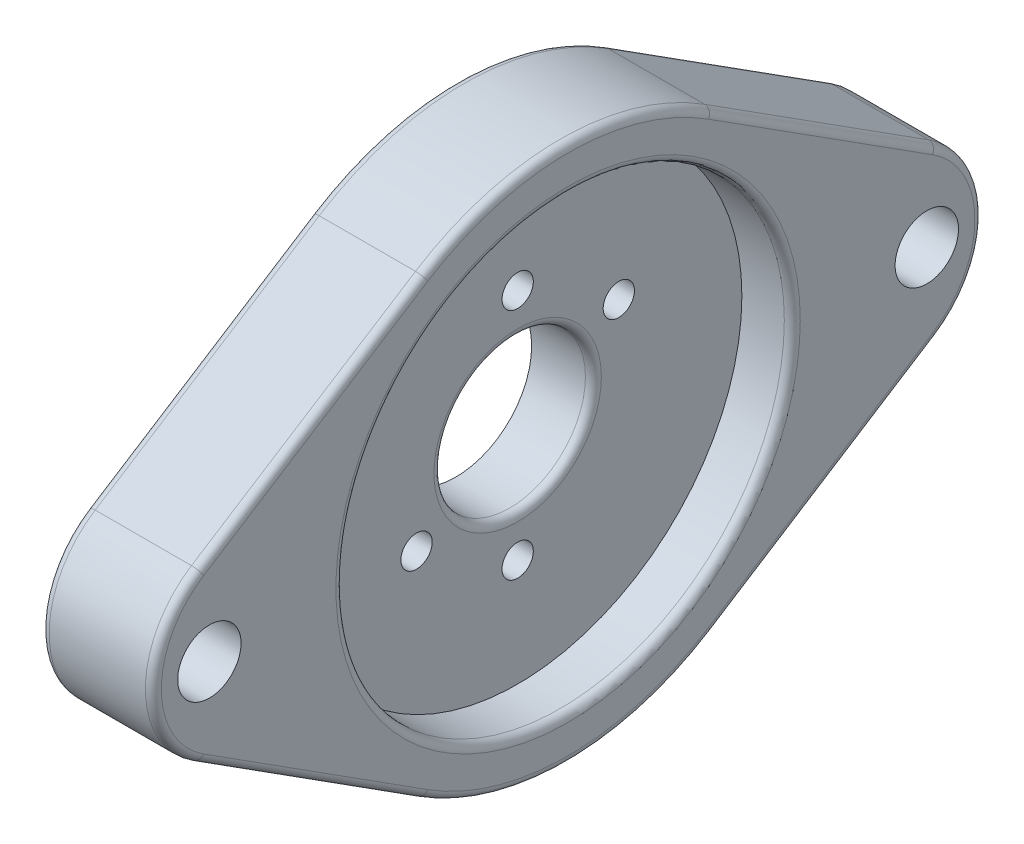
ISO-10303-21;
HEADER;
FILE_DESCRIPTION(('STEP AP214'),'2;1');
FILE_NAME('part.step','',(''),(''),'','','');
FILE_SCHEMA(('AUTOMOTIVE_DESIGN { 1 0 10303 214 1 1 1 1 }'));
ENDSEC;
DATA;
#1=APPLICATION_CONTEXT('core data for automotive mechanical design processes');
#2=APPLICATION_PROTOCOL_DEFINITION('international standard','automotive_design',2000,#1);
#3=PRODUCT_CONTEXT('',#1,'mechanical');
#4=PRODUCT('Part','Part','',(#3));
#5=PRODUCT_RELATED_PRODUCT_CATEGORY('part','',(#4));
#6=PRODUCT_DEFINITION_FORMATION('','',#4);
#7=PRODUCT_DEFINITION_CONTEXT('part definition',#1,'design');
#8=PRODUCT_DEFINITION('design','',#6,#7);
#9=PRODUCT_DEFINITION_SHAPE('','',#8);
#10=(LENGTH_UNIT() NAMED_UNIT(*) SI_UNIT(.MILLI.,.METRE.));
#11=(NAMED_UNIT(*) PLANE_ANGLE_UNIT() SI_UNIT($,.RADIAN.));
#12=(NAMED_UNIT(*) SI_UNIT($,.STERADIAN.) SOLID_ANGLE_UNIT());
#13=UNCERTAINTY_MEASURE_WITH_UNIT(LENGTH_MEASURE(1.E-05),#10,'distance_accuracy_value','');
#14=(GEOMETRIC_REPRESENTATION_CONTEXT(3) GLOBAL_UNCERTAINTY_ASSIGNED_CONTEXT((#13)) GLOBAL_UNIT_ASSIGNED_CONTEXT((#10,
#11,#12)) REPRESENTATION_CONTEXT('',''));
#15=CARTESIAN_POINT('',(0.,0.,0.));
#16=DIRECTION('',(0.,0.,1.));
#17=DIRECTION('',(1.,0.,0.));
#18=AXIS2_PLACEMENT_3D('',#15,#16,#17);
#19=CARTESIAN_POINT('',(0.,0.,0.));
#20=DIRECTION('',(1.,0.,0.));
#21=DIRECTION('',(0.,0.,-1.));
#22=AXIS2_PLACEMENT_3D('',#19,#20,#21);
#23=CYLINDRICAL_SURFACE('',#22,4.826);
#24=CARTESIAN_POINT('',(3.429,0.,0.));
#25=DIRECTION('',(1.,0.,0.));
#26=DIRECTION('',(0.,0.,-1.));
#27=AXIS2_PLACEMENT_3D('',#24,#25,#26);
#28=CIRCLE('',#27,4.826);
#29=CARTESIAN_POINT('',(3.429,0.,-4.826));
#30=VERTEX_POINT('',#29);
#31=EDGE_CURVE('E181',#30,#30,#28,.T.);
#32=ORIENTED_EDGE('',*,*,#31,.T.);
#33=EDGE_LOOP('',(#32));
#34=FACE_BOUND('',#33,.T.);
#35=CARTESIAN_POINT('',(0.,0.,0.));
#36=DIRECTION('',(1.,0.,0.));
#37=DIRECTION('',(0.,0.,-1.));
#38=AXIS2_PLACEMENT_3D('',#35,#36,#37);
#39=CIRCLE('',#38,4.826);
#40=CARTESIAN_POINT('',(0.,0.,-4.826));
#41=VERTEX_POINT('',#40);
#42=EDGE_CURVE('E360',#41,#41,#39,.T.);
#43=ORIENTED_EDGE('',*,*,#42,.F.);
#44=EDGE_LOOP('',(#43));
#45=FACE_BOUND('',#44,.T.);
#46=ADVANCED_FACE('F46',(#34,#45),#23,.F.);
#47=CARTESIAN_POINT('',(7.1501,0.,0.));
#48=DIRECTION('',(-1.,0.,0.));
#49=DIRECTION('',(0.,0.,1.));
#50=AXIS2_PLACEMENT_3D('',#47,#48,#49);
#51=CYLINDRICAL_SURFACE('',#50,17.145);
#52=DIRECTION('',(-1.,0.,0.));
#53=VECTOR('',#52,1.);
#54=CARTESIAN_POINT('',(7.1501,14.4571064134333,-9.21645805885674));
#55=LINE('',#54,#53);
#56=CARTESIAN_POINT('',(6.6421,14.4571064134333,-9.21645805885674));
#57=VERTEX_POINT('',#56);
#58=CARTESIAN_POINT('',(0.508,14.4571064134333,-9.21645805885674));
#59=VERTEX_POINT('',#58);
#60=EDGE_CURVE('E320',#57,#59,#55,.T.);
#61=ORIENTED_EDGE('',*,*,#60,.T.);
#62=CARTESIAN_POINT('',(0.508,0.,0.));
#63=DIRECTION('',(1.,0.,0.));
#64=DIRECTION('',(0.,0.,-1.));
#65=AXIS2_PLACEMENT_3D('',#62,#63,#64);
#66=CIRCLE('',#65,17.145);
#67=CARTESIAN_POINT('',(0.508,14.4571064134333,9.21645805885674));
#68=VERTEX_POINT('',#67);
#69=EDGE_CURVE('E55',#59,#68,#66,.T.);
#70=ORIENTED_EDGE('',*,*,#69,.T.);
#71=DIRECTION('',(-1.,0.,0.));
#72=VECTOR('',#71,1.);
#73=CARTESIAN_POINT('',(7.1501,14.4571064134333,9.21645805885674));
#74=LINE('',#73,#72);
#75=CARTESIAN_POINT('',(6.6421,14.4571064134333,9.21645805885674));
#76=VERTEX_POINT('',#75);
#77=EDGE_CURVE('E332',#76,#68,#74,.T.);
#78=ORIENTED_EDGE('',*,*,#77,.F.);
#79=CARTESIAN_POINT('',(6.6421,0.,0.));
#80=DIRECTION('',(1.,0.,0.));
#81=DIRECTION('',(0.,0.,-1.));
#82=AXIS2_PLACEMENT_3D('',#79,#80,#81);
#83=CIRCLE('',#82,17.145);
#84=EDGE_CURVE('E206',#76,#57,#83,.F.);
#85=ORIENTED_EDGE('',*,*,#84,.T.);
#86=EDGE_LOOP('',(#61,#70,#78,#85));
#87=FACE_BOUND('',#86,.T.);
#88=ADVANCED_FACE('F427',(#87),#51,.T.);
#89=CARTESIAN_POINT('',(7.1501,14.4571064134333,9.21645805885674));
#90=DIRECTION('',(0.,-0.843225804224749,-0.537559525159331));
#91=DIRECTION('',(0.,0.537559525159331,-0.843225804224749));
#92=AXIS2_PLACEMENT_3D('',#89,#90,#91);
#93=PLANE('',#92);
#94=ORIENTED_EDGE('',*,*,#77,.T.);
#95=DIRECTION('',(0.,-0.537559525159331,0.843225804224749));
#96=VECTOR('',#95,1.);
#97=CARTESIAN_POINT('',(0.508,14.4571064134333,9.21645805885674));
#98=LINE('',#97,#96);
#99=CARTESIAN_POINT('',(0.508,5.35448385682715,23.495));
#100=VERTEX_POINT('',#99);
#101=EDGE_CURVE('E254',#68,#100,#98,.T.);
#102=ORIENTED_EDGE('',*,*,#101,.T.);
#103=DIRECTION('',(-1.,0.,0.));
#104=VECTOR('',#103,1.);
#105=CARTESIAN_POINT('',(7.1501,5.35448385682715,23.495));
#106=LINE('',#105,#104);
#107=CARTESIAN_POINT('',(6.6421,5.35448385682715,23.495));
#108=VERTEX_POINT('',#107);
#109=EDGE_CURVE('E329',#108,#100,#106,.T.);
#110=ORIENTED_EDGE('',*,*,#109,.F.);
#111=DIRECTION('',(0.,-0.537559525159331,0.843225804224749));
#112=VECTOR('',#111,1.);
#113=CARTESIAN_POINT('',(6.6421,14.4571064134333,9.21645805885674));
#114=LINE('',#113,#112);
#115=EDGE_CURVE('E204',#108,#76,#114,.F.);
#116=ORIENTED_EDGE('',*,*,#115,.T.);
#117=EDGE_LOOP('',(#94,#102,#110,#116));
#118=FACE_BOUND('',#117,.T.);
#119=ADVANCED_FACE('F433',(#118),#93,.F.);
#120=CARTESIAN_POINT('',(7.1501,0.,20.0814970152382));
#121=DIRECTION('',(-1.,0.,0.));
#122=DIRECTION('',(0.,0.,1.));
#123=AXIS2_PLACEMENT_3D('',#120,#121,#122);
#124=CYLINDRICAL_SURFACE('',#123,6.35);
#125=ORIENTED_EDGE('',*,*,#109,.T.);
#126=CARTESIAN_POINT('',(0.508,0.,20.0814970152382));
#127=DIRECTION('',(1.,0.,0.));
#128=DIRECTION('',(0.,0.,-1.));
#129=AXIS2_PLACEMENT_3D('',#126,#127,#128);
#130=CIRCLE('',#129,6.35);
#131=CARTESIAN_POINT('',(0.508,-5.35448385682715,23.495));
#132=VERTEX_POINT('',#131);
#133=EDGE_CURVE('E252',#100,#132,#130,.T.);
#134=ORIENTED_EDGE('',*,*,#133,.T.);
#135=DIRECTION('',(-1.,0.,0.));
#136=VECTOR('',#135,1.);
#137=CARTESIAN_POINT('',(7.1501,-5.35448385682715,23.495));
#138=LINE('',#137,#136);
#139=CARTESIAN_POINT('',(6.6421,-5.35448385682715,23.495));
#140=VERTEX_POINT('',#139);
#141=EDGE_CURVE('E326',#140,#132,#138,.T.);
#142=ORIENTED_EDGE('',*,*,#141,.F.);
#143=CARTESIAN_POINT('',(6.6421,0.,20.0814970152382));
#144=DIRECTION('',(1.,0.,0.));
#145=DIRECTION('',(0.,0.,-1.));
#146=AXIS2_PLACEMENT_3D('',#143,#144,#145);
#147=CIRCLE('',#146,6.35);
#148=EDGE_CURVE('E202',#140,#108,#147,.F.);
#149=ORIENTED_EDGE('',*,*,#148,.T.);
#150=EDGE_LOOP('',(#125,#134,#142,#149));
#151=FACE_BOUND('',#150,.T.);
#152=ADVANCED_FACE('F456',(#151),#124,.T.);
#153=CARTESIAN_POINT('',(7.1501,-5.35448385682715,23.495));
#154=DIRECTION('',(0.,0.843225804224749,-0.537559525159331));
#155=DIRECTION('',(0.,0.537559525159331,0.843225804224749));
#156=AXIS2_PLACEMENT_3D('',#153,#154,#155);
#157=PLANE('',#156);
#158=ORIENTED_EDGE('',*,*,#141,.T.);
#159=DIRECTION('',(0.,-0.537559525159331,-0.843225804224749));
#160=VECTOR('',#159,1.);
#161=CARTESIAN_POINT('',(0.508,-5.35448385682715,23.495));
#162=LINE('',#161,#160);
#163=CARTESIAN_POINT('',(0.508,-14.4571064134333,9.21645805885674));
#164=VERTEX_POINT('',#163);
#165=EDGE_CURVE('E250',#132,#164,#162,.T.);
#166=ORIENTED_EDGE('',*,*,#165,.T.);
#167=DIRECTION('',(-1.,0.,0.));
#168=VECTOR('',#167,1.);
#169=CARTESIAN_POINT('',(7.1501,-14.4571064134333,9.21645805885674));
#170=LINE('',#169,#168);
#171=CARTESIAN_POINT('',(6.6421,-14.4571064134333,9.21645805885674));
#172=VERTEX_POINT('',#171);
#173=EDGE_CURVE('E318',#172,#164,#170,.T.);
#174=ORIENTED_EDGE('',*,*,#173,.F.);
#175=DIRECTION('',(0.,-0.537559525159331,-0.843225804224749));
#176=VECTOR('',#175,1.);
#177=CARTESIAN_POINT('',(6.6421,-5.35448385682715,23.495));
#178=LINE('',#177,#176);
#179=EDGE_CURVE('E200',#172,#140,#178,.F.);
#180=ORIENTED_EDGE('',*,*,#179,.T.);
#181=EDGE_LOOP('',(#158,#166,#174,#180));
#182=FACE_BOUND('',#181,.T.);
#183=ADVANCED_FACE('F452',(#182),#157,.F.);
#184=CARTESIAN_POINT('',(7.1501,0.,0.));
#185=DIRECTION('',(-1.,0.,0.));
#186=DIRECTION('',(0.,0.,1.));
#187=AXIS2_PLACEMENT_3D('',#184,#185,#186);
#188=CYLINDRICAL_SURFACE('',#187,17.145);
#189=ORIENTED_EDGE('',*,*,#173,.T.);
#190=CARTESIAN_POINT('',(0.508,0.,0.));
#191=DIRECTION('',(1.,0.,0.));
#192=DIRECTION('',(0.,0.,-1.));
#193=AXIS2_PLACEMENT_3D('',#190,#191,#192);
#194=CIRCLE('',#193,17.145);
#195=CARTESIAN_POINT('',(0.508,-14.4571064134333,-9.21645805885674));
#196=VERTEX_POINT('',#195);
#197=EDGE_CURVE('E248',#164,#196,#194,.T.);
#198=ORIENTED_EDGE('',*,*,#197,.T.);
#199=DIRECTION('',(-1.,0.,0.));
#200=VECTOR('',#199,1.);
#201=CARTESIAN_POINT('',(7.1501,-14.4571064134333,-9.21645805885674));
#202=LINE('',#201,#200);
#203=CARTESIAN_POINT('',(6.6421,-14.4571064134333,-9.21645805885674));
#204=VERTEX_POINT('',#203);
#205=EDGE_CURVE('E311',#204,#196,#202,.T.);
#206=ORIENTED_EDGE('',*,*,#205,.F.);
#207=CARTESIAN_POINT('',(6.6421,0.,0.));
#208=DIRECTION('',(1.,0.,0.));
#209=DIRECTION('',(0.,0.,-1.));
#210=AXIS2_PLACEMENT_3D('',#207,#208,#209);
#211=CIRCLE('',#210,17.145);
#212=EDGE_CURVE('E198',#204,#172,#211,.F.);
#213=ORIENTED_EDGE('',*,*,#212,.T.);
#214=EDGE_LOOP('',(#189,#198,#206,#213));
#215=FACE_BOUND('',#214,.T.);
#216=ADVANCED_FACE('F449',(#215),#188,.T.);
#217=CARTESIAN_POINT('',(7.1501,-5.35448385682715,-23.495));
#218=DIRECTION('',(0.,0.843225804224749,0.537559525159331));
#219=DIRECTION('',(0.,-0.537559525159331,0.843225804224749));
#220=AXIS2_PLACEMENT_3D('',#217,#218,#219);
#221=PLANE('',#220);
#222=ORIENTED_EDGE('',*,*,#205,.T.);
#223=DIRECTION('',(0.,0.537559525159331,-0.843225804224749));
#224=VECTOR('',#223,1.);
#225=CARTESIAN_POINT('',(0.508,-5.35448385682715,-23.495));
#226=LINE('',#225,#224);
#227=CARTESIAN_POINT('',(0.508,-5.35448385682715,-23.495));
#228=VERTEX_POINT('',#227);
#229=EDGE_CURVE('E246',#196,#228,#226,.T.);
#230=ORIENTED_EDGE('',*,*,#229,.T.);
#231=DIRECTION('',(-1.,0.,0.));
#232=VECTOR('',#231,1.);
#233=CARTESIAN_POINT('',(7.1501,-5.35448385682715,-23.495));
#234=LINE('',#233,#232);
#235=CARTESIAN_POINT('',(6.6421,-5.35448385682715,-23.495));
#236=VERTEX_POINT('',#235);
#237=EDGE_CURVE('E308',#236,#228,#234,.T.);
#238=ORIENTED_EDGE('',*,*,#237,.F.);
#239=DIRECTION('',(0.,0.537559525159331,-0.843225804224749));
#240=VECTOR('',#239,1.);
#241=CARTESIAN_POINT('',(6.6421,-14.4571064134333,-9.21645805885674));
#242=LINE('',#241,#240);
#243=EDGE_CURVE('E196',#236,#204,#242,.F.);
#244=ORIENTED_EDGE('',*,*,#243,.T.);
#245=EDGE_LOOP('',(#222,#230,#238,#244));
#246=FACE_BOUND('',#245,.T.);
#247=ADVANCED_FACE('F307',(#246),#221,.F.);
#248=CARTESIAN_POINT('',(7.1501,0.,-20.0814970152382));
#249=DIRECTION('',(-1.,0.,0.));
#250=DIRECTION('',(0.,0.,1.));
#251=AXIS2_PLACEMENT_3D('',#248,#249,#250);
#252=CYLINDRICAL_SURFACE('',#251,6.35);
#253=ORIENTED_EDGE('',*,*,#237,.T.);
#254=CARTESIAN_POINT('',(0.508,0.,-20.0814970152382));
#255=DIRECTION('',(1.,0.,0.));
#256=DIRECTION('',(0.,0.,-1.));
#257=AXIS2_PLACEMENT_3D('',#254,#255,#256);
#258=CIRCLE('',#257,6.35);
#259=CARTESIAN_POINT('',(0.508,5.35448385682715,-23.495));
#260=VERTEX_POINT('',#259);
#261=EDGE_CURVE('E207',#228,#260,#258,.T.);
#262=ORIENTED_EDGE('',*,*,#261,.T.);
#263=DIRECTION('',(-1.,0.,0.));
#264=VECTOR('',#263,1.);
#265=CARTESIAN_POINT('',(7.1501,5.35448385682715,-23.495));
#266=LINE('',#265,#264);
#267=CARTESIAN_POINT('',(6.6421,5.35448385682715,-23.495));
#268=VERTEX_POINT('',#267);
#269=EDGE_CURVE('E316',#268,#260,#266,.T.);
#270=ORIENTED_EDGE('',*,*,#269,.F.);
#271=CARTESIAN_POINT('',(6.6421,0.,-20.0814970152382));
#272=DIRECTION('',(1.,0.,0.));
#273=DIRECTION('',(0.,0.,-1.));
#274=AXIS2_PLACEMENT_3D('',#271,#272,#273);
#275=CIRCLE('',#274,6.35);
#276=EDGE_CURVE('E189',#268,#236,#275,.F.);
#277=ORIENTED_EDGE('',*,*,#276,.T.);
#278=EDGE_LOOP('',(#253,#262,#270,#277));
#279=FACE_BOUND('',#278,.T.);
#280=ADVANCED_FACE('F313',(#279),#252,.T.);
#281=CARTESIAN_POINT('',(7.1501,14.4571064134333,-9.21645805885674));
#282=DIRECTION('',(0.,-0.843225804224749,0.537559525159331));
#283=DIRECTION('',(0.,-0.537559525159331,-0.843225804224749));
#284=AXIS2_PLACEMENT_3D('',#281,#282,#283);
#285=PLANE('',#284);
#286=ORIENTED_EDGE('',*,*,#269,.T.);
#287=DIRECTION('',(0.,0.537559525159331,0.843225804224749));
#288=VECTOR('',#287,1.);
#289=CARTESIAN_POINT('',(0.508,14.4571064134333,-9.21645805885674));
#290=LINE('',#289,#288);
#291=EDGE_CURVE('E13',#260,#59,#290,.T.);
#292=ORIENTED_EDGE('',*,*,#291,.T.);
#293=ORIENTED_EDGE('',*,*,#60,.F.);
#294=DIRECTION('',(0.,0.537559525159331,0.843225804224749));
#295=VECTOR('',#294,1.);
#296=CARTESIAN_POINT('',(6.6421,5.35448385682716,-23.495));
#297=LINE('',#296,#295);
#298=EDGE_CURVE('E168',#57,#268,#297,.F.);
#299=ORIENTED_EDGE('',*,*,#298,.T.);
#300=EDGE_LOOP('',(#286,#292,#293,#299));
#301=FACE_BOUND('',#300,.T.);
#302=ADVANCED_FACE('F359',(#301),#285,.F.);
#303=CARTESIAN_POINT('',(7.1501,0.,0.));
#304=DIRECTION('',(1.,0.,0.));
#305=DIRECTION('',(0.,0.,-1.));
#306=AXIS2_PLACEMENT_3D('',#303,#304,#305);
#307=PLANE('',#306);
#308=CARTESIAN_POINT('',(7.1501,0.,-20.0814970152382));
#309=DIRECTION('',(1.,0.,0.));
#310=DIRECTION('',(0.,0.,-1.));
#311=AXIS2_PLACEMENT_3D('',#308,#309,#310);
#312=CIRCLE('',#311,5.842);
#313=CARTESIAN_POINT('',(7.1501,-4.92612514828098,-23.2219197612191));
#314=VERTEX_POINT('',#313);
#315=CARTESIAN_POINT('',(7.1501,4.92612514828098,-23.2219197612191));
#316=VERTEX_POINT('',#315);
#317=EDGE_CURVE('E186',#314,#316,#312,.T.);
#318=ORIENTED_EDGE('',*,*,#317,.T.);
#319=DIRECTION('',(0.,0.537559525159331,0.843225804224749));
#320=VECTOR('',#319,1.);
#321=CARTESIAN_POINT('',(7.1501,14.0287477048871,-8.9433778200758));
#322=LINE('',#321,#320);
#323=CARTESIAN_POINT('',(7.1501,14.0287477048871,-8.94337782007579));
#324=VERTEX_POINT('',#323);
#325=EDGE_CURVE('E166',#316,#324,#322,.T.);
#326=ORIENTED_EDGE('',*,*,#325,.T.);
#327=CARTESIAN_POINT('',(7.1501,0.,0.));
#328=DIRECTION('',(1.,0.,0.));
#329=DIRECTION('',(0.,0.,-1.));
#330=AXIS2_PLACEMENT_3D('',#327,#328,#329);
#331=CIRCLE('',#330,16.637);
#332=CARTESIAN_POINT('',(7.1501,14.0287477048871,8.9433778200758));
#333=VERTEX_POINT('',#332);
#334=EDGE_CURVE('E174',#324,#333,#331,.T.);
#335=ORIENTED_EDGE('',*,*,#334,.T.);
#336=DIRECTION('',(0.,-0.537559525159331,0.843225804224749));
#337=VECTOR('',#336,1.);
#338=CARTESIAN_POINT('',(7.1501,4.92612514828098,23.2219197612191));
#339=LINE('',#338,#337);
#340=CARTESIAN_POINT('',(7.1501,4.92612514828098,23.2219197612191));
#341=VERTEX_POINT('',#340);
#342=EDGE_CURVE('E180',#333,#341,#339,.T.);
#343=ORIENTED_EDGE('',*,*,#342,.T.);
#344=CARTESIAN_POINT('',(7.1501,0.,20.0814970152382));
#345=DIRECTION('',(1.,0.,0.));
#346=DIRECTION('',(0.,0.,-1.));
#347=AXIS2_PLACEMENT_3D('',#344,#345,#346);
#348=CIRCLE('',#347,5.842);
#349=CARTESIAN_POINT('',(7.1501,-4.92612514828098,23.2219197612191));
#350=VERTEX_POINT('',#349);
#351=EDGE_CURVE('E346',#341,#350,#348,.T.);
#352=ORIENTED_EDGE('',*,*,#351,.T.);
#353=DIRECTION('',(0.,-0.537559525159331,-0.843225804224749));
#354=VECTOR('',#353,1.);
#355=CARTESIAN_POINT('',(7.1501,-14.0287477048871,8.9433778200758));
#356=LINE('',#355,#354);
#357=CARTESIAN_POINT('',(7.1501,-14.0287477048871,8.9433778200758));
#358=VERTEX_POINT('',#357);
#359=EDGE_CURVE('E348',#350,#358,#356,.T.);
#360=ORIENTED_EDGE('',*,*,#359,.T.);
#361=CARTESIAN_POINT('',(7.1501,0.,0.));
#362=DIRECTION('',(1.,0.,0.));
#363=DIRECTION('',(0.,0.,-1.));
#364=AXIS2_PLACEMENT_3D('',#361,#362,#363);
#365=CIRCLE('',#364,16.637);
#366=CARTESIAN_POINT('',(7.1501,-14.0287477048871,-8.94337782007579));
#367=VERTEX_POINT('',#366);
#368=EDGE_CURVE('E350',#358,#367,#365,.T.);
#369=ORIENTED_EDGE('',*,*,#368,.T.);
#370=DIRECTION('',(0.,0.537559525159331,-0.843225804224749));
#371=VECTOR('',#370,1.);
#372=CARTESIAN_POINT('',(7.1501,-4.92612514828098,-23.2219197612191));
#373=LINE('',#372,#371);
#374=EDGE_CURVE('E191',#367,#314,#373,.T.);
#375=ORIENTED_EDGE('',*,*,#374,.T.);
#376=EDGE_LOOP('',(#318,#326,#335,#343,#352,#360,#369,#375));
#377=FACE_BOUND('',#376,.T.);
#378=CARTESIAN_POINT('',(7.1501,0.,0.));
#379=DIRECTION('',(1.,0.,0.));
#380=DIRECTION('',(0.,0.,-1.));
#381=AXIS2_PLACEMENT_3D('',#378,#379,#380);
#382=CIRCLE('',#381,14.7955);
#383=CARTESIAN_POINT('',(7.1501,0.,-14.7955));
#384=VERTEX_POINT('',#383);
#385=EDGE_CURVE('E337',#384,#384,#382,.F.);
#386=ORIENTED_EDGE('',*,*,#385,.T.);
#387=EDGE_LOOP('',(#386));
#388=FACE_BOUND('',#387,.T.);
#389=CARTESIAN_POINT('',(7.1501,0.,22.86));
#390=DIRECTION('',(1.,0.,0.));
#391=DIRECTION('',(0.,0.,-1.));
#392=AXIS2_PLACEMENT_3D('',#389,#390,#391);
#393=CIRCLE('',#392,2.01929999999999);
#394=CARTESIAN_POINT('',(7.1501,0.,20.8407));
#395=VERTEX_POINT('',#394);
#396=EDGE_CURVE('E226',#395,#395,#393,.T.);
#397=ORIENTED_EDGE('',*,*,#396,.F.);
#398=EDGE_LOOP('',(#397));
#399=FACE_BOUND('',#398,.T.);
#400=CARTESIAN_POINT('',(7.1501,0.,-22.86));
#401=DIRECTION('',(1.,0.,0.));
#402=DIRECTION('',(0.,0.,-1.));
#403=AXIS2_PLACEMENT_3D('',#400,#401,#402);
#404=CIRCLE('',#403,2.01929999999999);
#405=CARTESIAN_POINT('',(7.1501,0.,-24.8793));
#406=VERTEX_POINT('',#405);
#407=EDGE_CURVE('E394',#406,#406,#404,.T.);
#408=ORIENTED_EDGE('',*,*,#407,.F.);
#409=EDGE_LOOP('',(#408));
#410=FACE_BOUND('',#409,.T.);
#411=ADVANCED_FACE('F183',(#377,#388,#399,#410),#307,.T.);
#412=CARTESIAN_POINT('',(0.,0.,0.));
#413=DIRECTION('',(1.,0.,0.));
#414=DIRECTION('',(0.,0.,-1.));
#415=AXIS2_PLACEMENT_3D('',#412,#413,#414);
#416=PLANE('',#415);
#417=DIRECTION('',(0.,0.537559525159331,0.843225804224749));
#418=VECTOR('',#417,1.);
#419=CARTESIAN_POINT('',(0.,14.0287477048872,-8.9433778200758));
#420=LINE('',#419,#418);
#421=CARTESIAN_POINT('',(0.,14.0287477048871,-8.9433778200758));
#422=VERTEX_POINT('',#421);
#423=CARTESIAN_POINT('',(0.,4.92612514828098,-23.2219197612191));
#424=VERTEX_POINT('',#423);
#425=EDGE_CURVE('E229',#422,#424,#420,.F.);
#426=ORIENTED_EDGE('',*,*,#425,.T.);
#427=CARTESIAN_POINT('',(0.,0.,-20.0814970152382));
#428=DIRECTION('',(1.,0.,0.));
#429=DIRECTION('',(0.,0.,-1.));
#430=AXIS2_PLACEMENT_3D('',#427,#428,#429);
#431=CIRCLE('',#430,5.842);
#432=CARTESIAN_POINT('',(0.,-4.92612514828098,-23.2219197612191));
#433=VERTEX_POINT('',#432);
#434=EDGE_CURVE('E243',#424,#433,#431,.F.);
#435=ORIENTED_EDGE('',*,*,#434,.T.);
#436=DIRECTION('',(0.,0.537559525159331,-0.843225804224749));
#437=VECTOR('',#436,1.);
#438=CARTESIAN_POINT('',(0.,-14.0287477048871,-8.9433778200758));
#439=LINE('',#438,#437);
#440=CARTESIAN_POINT('',(0.,-14.0287477048871,-8.94337782007579));
#441=VERTEX_POINT('',#440);
#442=EDGE_CURVE('E241',#433,#441,#439,.F.);
#443=ORIENTED_EDGE('',*,*,#442,.T.);
#444=CARTESIAN_POINT('',(0.,0.,0.));
#445=DIRECTION('',(1.,0.,0.));
#446=DIRECTION('',(0.,0.,-1.));
#447=AXIS2_PLACEMENT_3D('',#444,#445,#446);
#448=CIRCLE('',#447,16.637);
#449=CARTESIAN_POINT('',(0.,-14.0287477048871,8.9433778200758));
#450=VERTEX_POINT('',#449);
#451=EDGE_CURVE('E239',#441,#450,#448,.F.);
#452=ORIENTED_EDGE('',*,*,#451,.T.);
#453=DIRECTION('',(0.,-0.537559525159331,-0.843225804224749));
#454=VECTOR('',#453,1.);
#455=CARTESIAN_POINT('',(0.,-14.0287477048871,8.94337782007579));
#456=LINE('',#455,#454);
#457=CARTESIAN_POINT('',(0.,-4.92612514828098,23.2219197612191));
#458=VERTEX_POINT('',#457);
#459=EDGE_CURVE('E237',#450,#458,#456,.F.);
#460=ORIENTED_EDGE('',*,*,#459,.T.);
#461=CARTESIAN_POINT('',(0.,0.,20.0814970152382));
#462=DIRECTION('',(1.,0.,0.));
#463=DIRECTION('',(0.,0.,-1.));
#464=AXIS2_PLACEMENT_3D('',#461,#462,#463);
#465=CIRCLE('',#464,5.842);
#466=CARTESIAN_POINT('',(0.,4.92612514828098,23.2219197612191));
#467=VERTEX_POINT('',#466);
#468=EDGE_CURVE('E235',#458,#467,#465,.F.);
#469=ORIENTED_EDGE('',*,*,#468,.T.);
#470=DIRECTION('',(0.,-0.537559525159331,0.843225804224749));
#471=VECTOR('',#470,1.);
#472=CARTESIAN_POINT('',(0.,14.0287477048871,8.94337782007579));
#473=LINE('',#472,#471);
#474=CARTESIAN_POINT('',(0.,14.0287477048871,8.9433778200758));
#475=VERTEX_POINT('',#474);
#476=EDGE_CURVE('E233',#467,#475,#473,.F.);
#477=ORIENTED_EDGE('',*,*,#476,.T.);
#478=CARTESIAN_POINT('',(0.,0.,0.));
#479=DIRECTION('',(1.,0.,0.));
#480=DIRECTION('',(0.,0.,-1.));
#481=AXIS2_PLACEMENT_3D('',#478,#479,#480);
#482=CIRCLE('',#481,16.637);
#483=EDGE_CURVE('E231',#475,#422,#482,.F.);
#484=ORIENTED_EDGE('',*,*,#483,.T.);
#485=EDGE_LOOP('',(#426,#435,#443,#452,#460,#469,#477,#484));
#486=FACE_BOUND('',#485,.T.);
#487=CARTESIAN_POINT('',(0.,0.,22.86));
#488=DIRECTION('',(1.,0.,0.));
#489=DIRECTION('',(0.,0.,-1.));
#490=AXIS2_PLACEMENT_3D('',#487,#488,#489);
#491=CIRCLE('',#490,2.0193);
#492=CARTESIAN_POINT('',(0.,0.,20.8407));
#493=VERTEX_POINT('',#492);
#494=EDGE_CURVE('E397',#493,#493,#491,.T.);
#495=ORIENTED_EDGE('',*,*,#494,.T.);
#496=EDGE_LOOP('',(#495));
#497=FACE_BOUND('',#496,.T.);
#498=CARTESIAN_POINT('',(0.,0.,-22.86));
#499=DIRECTION('',(1.,0.,0.));
#500=DIRECTION('',(0.,0.,-1.));
#501=AXIS2_PLACEMENT_3D('',#498,#499,#500);
#502=CIRCLE('',#501,2.0193);
#503=CARTESIAN_POINT('',(0.,0.,-24.8793));
#504=VERTEX_POINT('',#503);
#505=EDGE_CURVE('E391',#504,#504,#502,.T.);
#506=ORIENTED_EDGE('',*,*,#505,.T.);
#507=EDGE_LOOP('',(#506));
#508=FACE_BOUND('',#507,.T.);
#509=CARTESIAN_POINT('',(0.,7.4422,0.));
#510=DIRECTION('',(1.,0.,0.));
#511=DIRECTION('',(0.,0.,-1.));
#512=AXIS2_PLACEMENT_3D('',#509,#510,#511);
#513=CIRCLE('',#512,0.996949999999998);
#514=CARTESIAN_POINT('',(0.,7.4422,-0.996949999999996));
#515=VERTEX_POINT('',#514);
#516=EDGE_CURVE('E385',#515,#515,#513,.T.);
#517=ORIENTED_EDGE('',*,*,#516,.T.);
#518=EDGE_LOOP('',(#517));
#519=FACE_BOUND('',#518,.T.);
#520=CARTESIAN_POINT('',(0.,-7.4422,0.));
#521=DIRECTION('',(1.,0.,0.));
#522=DIRECTION('',(0.,0.,-1.));
#523=AXIS2_PLACEMENT_3D('',#520,#521,#522);
#524=CIRCLE('',#523,0.996949999999999);
#525=CARTESIAN_POINT('',(0.,-7.4422,-0.996949999999999));
#526=VERTEX_POINT('',#525);
#527=EDGE_CURVE('E379',#526,#526,#524,.T.);
#528=ORIENTED_EDGE('',*,*,#527,.T.);
#529=EDGE_LOOP('',(#528));
#530=FACE_BOUND('',#529,.T.);
#531=CARTESIAN_POINT('',(0.,3.72110000000003,-6.44513426004453));
#532=DIRECTION('',(1.,0.,0.));
#533=DIRECTION('',(0.,0.,-1.));
#534=AXIS2_PLACEMENT_3D('',#531,#532,#533);
#535=CIRCLE('',#534,0.996949999999999);
#536=CARTESIAN_POINT('',(0.,3.72110000000003,-7.44208426004453));
#537=VERTEX_POINT('',#536);
#538=EDGE_CURVE('E373',#537,#537,#535,.T.);
#539=ORIENTED_EDGE('',*,*,#538,.T.);
#540=EDGE_LOOP('',(#539));
#541=FACE_BOUND('',#540,.T.);
#542=CARTESIAN_POINT('',(0.,-3.72110000000004,6.44513426004454));
#543=DIRECTION('',(1.,0.,0.));
#544=DIRECTION('',(0.,0.,-1.));
#545=AXIS2_PLACEMENT_3D('',#542,#543,#544);
#546=CIRCLE('',#545,0.996949999999999);
#547=CARTESIAN_POINT('',(0.,-3.72110000000004,5.44818426004454));
#548=VERTEX_POINT('',#547);
#549=EDGE_CURVE('E367',#548,#548,#546,.T.);
#550=ORIENTED_EDGE('',*,*,#549,.T.);
#551=EDGE_LOOP('',(#550));
#552=FACE_BOUND('',#551,.T.);
#553=ORIENTED_EDGE('',*,*,#42,.T.);
#554=EDGE_LOOP('',(#553));
#555=FACE_BOUND('',#554,.T.);
#556=ADVANCED_FACE('F289',(#486,#497,#508,#519,#530,#541,#552,#555),#416,.F.);
#557=CARTESIAN_POINT('',(3.937,0.,0.));
#558=DIRECTION('',(1.,0.,0.));
#559=DIRECTION('',(0.,0.,-1.));
#560=AXIS2_PLACEMENT_3D('',#557,#558,#559);
#561=PLANE('',#560);
#562=CARTESIAN_POINT('',(3.937,0.,0.));
#563=DIRECTION('',(1.,0.,0.));
#564=DIRECTION('',(0.,0.,-1.));
#565=AXIS2_PLACEMENT_3D('',#562,#563,#564);
#566=CIRCLE('',#565,5.334);
#567=CARTESIAN_POINT('',(3.937,0.,-5.334));
#568=VERTEX_POINT('',#567);
#569=EDGE_CURVE('E340',#568,#568,#566,.F.);
#570=ORIENTED_EDGE('',*,*,#569,.T.);
#571=EDGE_LOOP('',(#570));
#572=FACE_BOUND('',#571,.T.);
#573=CARTESIAN_POINT('',(3.937,7.4422,0.));
#574=DIRECTION('',(1.,0.,0.));
#575=DIRECTION('',(0.,0.,-1.));
#576=AXIS2_PLACEMENT_3D('',#573,#574,#575);
#577=CIRCLE('',#576,0.99695);
#578=CARTESIAN_POINT('',(3.937,7.4422,-0.996949999999997));
#579=VERTEX_POINT('',#578);
#580=EDGE_CURVE('E388',#579,#579,#577,.T.);
#581=ORIENTED_EDGE('',*,*,#580,.F.);
#582=EDGE_LOOP('',(#581));
#583=FACE_BOUND('',#582,.T.);
#584=CARTESIAN_POINT('',(3.937,-7.4422,0.));
#585=DIRECTION('',(1.,0.,0.));
#586=DIRECTION('',(0.,0.,-1.));
#587=AXIS2_PLACEMENT_3D('',#584,#585,#586);
#588=CIRCLE('',#587,0.99695);
#589=CARTESIAN_POINT('',(3.937,-7.4422,-0.99695));
#590=VERTEX_POINT('',#589);
#591=EDGE_CURVE('E382',#590,#590,#588,.T.);
#592=ORIENTED_EDGE('',*,*,#591,.F.);
#593=EDGE_LOOP('',(#592));
#594=FACE_BOUND('',#593,.T.);
#595=CARTESIAN_POINT('',(3.937,3.72110000000003,-6.44513426004453));
#596=DIRECTION('',(1.,0.,0.));
#597=DIRECTION('',(0.,0.,-1.));
#598=AXIS2_PLACEMENT_3D('',#595,#596,#597);
#599=CIRCLE('',#598,0.99695);
#600=CARTESIAN_POINT('',(3.937,3.72110000000003,-7.44208426004453));
#601=VERTEX_POINT('',#600);
#602=EDGE_CURVE('E376',#601,#601,#599,.T.);
#603=ORIENTED_EDGE('',*,*,#602,.F.);
#604=EDGE_LOOP('',(#603));
#605=FACE_BOUND('',#604,.T.);
#606=CARTESIAN_POINT('',(3.937,-3.72110000000004,6.44513426004454));
#607=DIRECTION('',(1.,0.,0.));
#608=DIRECTION('',(0.,0.,-1.));
#609=AXIS2_PLACEMENT_3D('',#606,#607,#608);
#610=CIRCLE('',#609,0.99695);
#611=CARTESIAN_POINT('',(3.937,-3.72110000000004,5.44818426004454));
#612=VERTEX_POINT('',#611);
#613=EDGE_CURVE('E370',#612,#612,#610,.T.);
#614=ORIENTED_EDGE('',*,*,#613,.F.);
#615=EDGE_LOOP('',(#614));
#616=FACE_BOUND('',#615,.T.);
#617=CARTESIAN_POINT('',(3.937,0.,0.));
#618=DIRECTION('',(1.,0.,0.));
#619=DIRECTION('',(0.,0.,-1.));
#620=AXIS2_PLACEMENT_3D('',#617,#618,#619);
#621=CIRCLE('',#620,14.2875);
#622=CARTESIAN_POINT('',(3.937,0.,-14.2875));
#623=VERTEX_POINT('',#622);
#624=EDGE_CURVE('E362',#623,#623,#621,.T.);
#625=ORIENTED_EDGE('',*,*,#624,.T.);
#626=EDGE_LOOP('',(#625));
#627=FACE_BOUND('',#626,.T.);
#628=ADVANCED_FACE('F442',(#572,#583,#594,#605,#616,#627),#561,.T.);
#629=CARTESIAN_POINT('',(3.937,0.,0.));
#630=DIRECTION('',(1.,0.,0.));
#631=DIRECTION('',(0.,0.,-1.));
#632=AXIS2_PLACEMENT_3D('',#629,#630,#631);
#633=CYLINDRICAL_SURFACE('',#632,14.2875);
#634=CARTESIAN_POINT('',(6.6421,0.,0.));
#635=DIRECTION('',(1.,0.,0.));
#636=DIRECTION('',(0.,0.,-1.));
#637=AXIS2_PLACEMENT_3D('',#634,#635,#636);
#638=CIRCLE('',#637,14.2875);
#639=CARTESIAN_POINT('',(6.6421,0.,-14.2875));
#640=VERTEX_POINT('',#639);
#641=EDGE_CURVE('E334',#640,#640,#638,.T.);
#642=ORIENTED_EDGE('',*,*,#641,.T.);
#643=EDGE_LOOP('',(#642));
#644=FACE_BOUND('',#643,.T.);
#645=ORIENTED_EDGE('',*,*,#624,.F.);
#646=EDGE_LOOP('',(#645));
#647=FACE_BOUND('',#646,.T.);
#648=ADVANCED_FACE('F437',(#644,#647),#633,.F.);
#649=CARTESIAN_POINT('',(3.937,-3.72110000000004,6.44513426004454));
#650=DIRECTION('',(1.,0.,0.));
#651=DIRECTION('',(0.,0.,-1.));
#652=AXIS2_PLACEMENT_3D('',#649,#650,#651);
#653=CYLINDRICAL_SURFACE('',#652,0.996949999999999);
#654=ORIENTED_EDGE('',*,*,#549,.F.);
#655=EDGE_LOOP('',(#654));
#656=FACE_BOUND('',#655,.T.);
#657=ORIENTED_EDGE('',*,*,#613,.T.);
#658=EDGE_LOOP('',(#657));
#659=FACE_BOUND('',#658,.T.);
#660=ADVANCED_FACE('F578',(#656,#659),#653,.F.);
#661=CARTESIAN_POINT('',(3.937,3.72110000000003,-6.44513426004453));
#662=DIRECTION('',(1.,0.,0.));
#663=DIRECTION('',(0.,0.,-1.));
#664=AXIS2_PLACEMENT_3D('',#661,#662,#663);
#665=CYLINDRICAL_SURFACE('',#664,0.996949999999999);
#666=ORIENTED_EDGE('',*,*,#538,.F.);
#667=EDGE_LOOP('',(#666));
#668=FACE_BOUND('',#667,.T.);
#669=ORIENTED_EDGE('',*,*,#602,.T.);
#670=EDGE_LOOP('',(#669));
#671=FACE_BOUND('',#670,.T.);
#672=ADVANCED_FACE('F591',(#668,#671),#665,.F.);
#673=CARTESIAN_POINT('',(3.937,-7.4422,0.));
#674=DIRECTION('',(1.,0.,0.));
#675=DIRECTION('',(0.,0.,-1.));
#676=AXIS2_PLACEMENT_3D('',#673,#674,#675);
#677=CYLINDRICAL_SURFACE('',#676,0.996949999999999);
#678=ORIENTED_EDGE('',*,*,#527,.F.);
#679=EDGE_LOOP('',(#678));
#680=FACE_BOUND('',#679,.T.);
#681=ORIENTED_EDGE('',*,*,#591,.T.);
#682=EDGE_LOOP('',(#681));
#683=FACE_BOUND('',#682,.T.);
#684=ADVANCED_FACE('F422',(#680,#683),#677,.F.);
#685=CARTESIAN_POINT('',(3.937,7.4422,0.));
#686=DIRECTION('',(1.,0.,0.));
#687=DIRECTION('',(0.,0.,-1.));
#688=AXIS2_PLACEMENT_3D('',#685,#686,#687);
#689=CYLINDRICAL_SURFACE('',#688,0.996949999999999);
#690=ORIENTED_EDGE('',*,*,#516,.F.);
#691=EDGE_LOOP('',(#690));
#692=FACE_BOUND('',#691,.T.);
#693=ORIENTED_EDGE('',*,*,#580,.T.);
#694=EDGE_LOOP('',(#693));
#695=FACE_BOUND('',#694,.T.);
#696=ADVANCED_FACE('F412',(#692,#695),#689,.F.);
#697=CARTESIAN_POINT('',(7.1501,0.,-22.86));
#698=DIRECTION('',(1.,0.,0.));
#699=DIRECTION('',(0.,0.,-1.));
#700=AXIS2_PLACEMENT_3D('',#697,#698,#699);
#701=CYLINDRICAL_SURFACE('',#700,2.01929999999999);
#702=ORIENTED_EDGE('',*,*,#505,.F.);
#703=EDGE_LOOP('',(#702));
#704=FACE_BOUND('',#703,.T.);
#705=ORIENTED_EDGE('',*,*,#407,.T.);
#706=EDGE_LOOP('',(#705));
#707=FACE_BOUND('',#706,.T.);
#708=ADVANCED_FACE('F410',(#704,#707),#701,.F.);
#709=CARTESIAN_POINT('',(7.1501,0.,22.86));
#710=DIRECTION('',(1.,0.,0.));
#711=DIRECTION('',(0.,0.,-1.));
#712=AXIS2_PLACEMENT_3D('',#709,#710,#711);
#713=CYLINDRICAL_SURFACE('',#712,2.01929999999999);
#714=ORIENTED_EDGE('',*,*,#494,.F.);
#715=EDGE_LOOP('',(#714));
#716=FACE_BOUND('',#715,.T.);
#717=ORIENTED_EDGE('',*,*,#396,.T.);
#718=EDGE_LOOP('',(#717));
#719=FACE_BOUND('',#718,.T.);
#720=ADVANCED_FACE('F403',(#716,#719),#713,.F.);
#721=CARTESIAN_POINT('',(6.6421,0.,0.));
#722=DIRECTION('',(1.,0.,0.));
#723=DIRECTION('',(0.,0.,-1.));
#724=AXIS2_PLACEMENT_3D('',#721,#722,#723);
#725=TOROIDAL_SURFACE('',#724,14.7955,0.508);
#726=ORIENTED_EDGE('',*,*,#385,.F.);
#727=EDGE_LOOP('',(#726));
#728=FACE_BOUND('',#727,.T.);
#729=ORIENTED_EDGE('',*,*,#641,.F.);
#730=EDGE_LOOP('',(#729));
#731=FACE_BOUND('',#730,.T.);
#732=ADVANCED_FACE('F419',(#728,#731),#725,.T.);
#733=CARTESIAN_POINT('',(3.429,0.,0.));
#734=DIRECTION('',(1.,0.,0.));
#735=DIRECTION('',(0.,0.,-1.));
#736=AXIS2_PLACEMENT_3D('',#733,#734,#735);
#737=TOROIDAL_SURFACE('',#736,5.334,0.508);
#738=ORIENTED_EDGE('',*,*,#31,.F.);
#739=EDGE_LOOP('',(#738));
#740=FACE_BOUND('',#739,.T.);
#741=ORIENTED_EDGE('',*,*,#569,.F.);
#742=EDGE_LOOP('',(#741));
#743=FACE_BOUND('',#742,.T.);
#744=ADVANCED_FACE('F466',(#740,#743),#737,.T.);
#745=CARTESIAN_POINT('',(6.6421,-14.0287477048871,8.94337782007579));
#746=DIRECTION('',(0.,0.537559525159331,0.843225804224749));
#747=DIRECTION('',(0.,-0.843225804224749,0.537559525159331));
#748=AXIS2_PLACEMENT_3D('',#745,#746,#747);
#749=CYLINDRICAL_SURFACE('',#748,0.508);
#750=CARTESIAN_POINT('',(6.6421,-4.92612514828098,23.2219197612191));
#751=DIRECTION('',(0.,0.537559525159333,0.843225804224748));
#752=DIRECTION('',(0.,-0.843225804224748,0.537559525159333));
#753=AXIS2_PLACEMENT_3D('',#750,#751,#752);
#754=CIRCLE('',#753,0.508);
#755=EDGE_CURVE('E220',#140,#350,#754,.T.);
#756=ORIENTED_EDGE('',*,*,#755,.F.);
#757=ORIENTED_EDGE('',*,*,#179,.F.);
#758=CARTESIAN_POINT('',(6.6421,-14.0287477048871,8.9433778200758));
#759=DIRECTION('',(0.,-0.53755952515933,-0.84322580422475));
#760=DIRECTION('',(0.,0.84322580422475,-0.53755952515933));
#761=AXIS2_PLACEMENT_3D('',#758,#759,#760);
#762=CIRCLE('',#761,0.508);
#763=EDGE_CURVE('E223',#358,#172,#762,.T.);
#764=ORIENTED_EDGE('',*,*,#763,.F.);
#765=ORIENTED_EDGE('',*,*,#359,.F.);
#766=EDGE_LOOP('',(#756,#757,#764,#765));
#767=FACE_BOUND('',#766,.T.);
#768=ADVANCED_FACE('F470',(#767),#749,.T.);
#769=CARTESIAN_POINT('',(6.6421,0.,0.));
#770=DIRECTION('',(1.,0.,0.));
#771=DIRECTION('',(0.,0.,-1.));
#772=AXIS2_PLACEMENT_3D('',#769,#770,#771);
#773=TOROIDAL_SURFACE('',#772,16.637,0.508);
#774=ORIENTED_EDGE('',*,*,#763,.T.);
#775=ORIENTED_EDGE('',*,*,#212,.F.);
#776=CARTESIAN_POINT('',(6.6421,-14.0287477048871,-8.94337782007579));
#777=DIRECTION('',(0.,0.53755952515933,-0.843225804224749));
#778=DIRECTION('',(0.,0.843225804224749,0.53755952515933));
#779=AXIS2_PLACEMENT_3D('',#776,#777,#778);
#780=CIRCLE('',#779,0.508);
#781=EDGE_CURVE('E217',#367,#204,#780,.T.);
#782=ORIENTED_EDGE('',*,*,#781,.F.);
#783=ORIENTED_EDGE('',*,*,#368,.F.);
#784=EDGE_LOOP('',(#774,#775,#782,#783));
#785=FACE_BOUND('',#784,.T.);
#786=ADVANCED_FACE('F487',(#785),#773,.T.);
#787=CARTESIAN_POINT('',(6.6421,0.,20.0814970152382));
#788=DIRECTION('',(1.,0.,0.));
#789=DIRECTION('',(0.,0.,-1.));
#790=AXIS2_PLACEMENT_3D('',#787,#788,#789);
#791=TOROIDAL_SURFACE('',#790,5.842,0.508);
#792=ORIENTED_EDGE('',*,*,#755,.T.);
#793=ORIENTED_EDGE('',*,*,#351,.F.);
#794=CARTESIAN_POINT('',(6.6421,4.92612514828098,23.2219197612191));
#795=DIRECTION('',(0.,0.537559525159333,-0.843225804224748));
#796=DIRECTION('',(0.,0.843225804224748,0.537559525159333));
#797=AXIS2_PLACEMENT_3D('',#794,#795,#796);
#798=CIRCLE('',#797,0.508);
#799=EDGE_CURVE('E214',#108,#341,#798,.T.);
#800=ORIENTED_EDGE('',*,*,#799,.F.);
#801=ORIENTED_EDGE('',*,*,#148,.F.);
#802=EDGE_LOOP('',(#792,#793,#800,#801));
#803=FACE_BOUND('',#802,.T.);
#804=ADVANCED_FACE('F484',(#803),#791,.T.);
#805=CARTESIAN_POINT('',(6.6421,-14.0287477048871,-8.9433778200758));
#806=DIRECTION('',(0.,-0.537559525159331,0.843225804224749));
#807=DIRECTION('',(0.,-0.843225804224749,-0.537559525159331));
#808=AXIS2_PLACEMENT_3D('',#805,#806,#807);
#809=CYLINDRICAL_SURFACE('',#808,0.508);
#810=ORIENTED_EDGE('',*,*,#781,.T.);
#811=ORIENTED_EDGE('',*,*,#243,.F.);
#812=CARTESIAN_POINT('',(6.6421,-4.92612514828098,-23.2219197612191));
#813=DIRECTION('',(0.,0.537559525159333,-0.843225804224747));
#814=DIRECTION('',(0.,0.843225804224747,0.537559525159334));
#815=AXIS2_PLACEMENT_3D('',#812,#813,#814);
#816=CIRCLE('',#815,0.508);
#817=EDGE_CURVE('E211',#314,#236,#816,.T.);
#818=ORIENTED_EDGE('',*,*,#817,.F.);
#819=ORIENTED_EDGE('',*,*,#374,.F.);
#820=EDGE_LOOP('',(#810,#811,#818,#819));
#821=FACE_BOUND('',#820,.T.);
#822=ADVANCED_FACE('F356',(#821),#809,.T.);
#823=CARTESIAN_POINT('',(6.6421,14.0287477048871,8.94337782007579));
#824=DIRECTION('',(0.,0.537559525159331,-0.843225804224749));
#825=DIRECTION('',(0.,0.843225804224749,0.537559525159331));
#826=AXIS2_PLACEMENT_3D('',#823,#824,#825);
#827=CYLINDRICAL_SURFACE('',#826,0.508);
#828=ORIENTED_EDGE('',*,*,#799,.T.);
#829=ORIENTED_EDGE('',*,*,#342,.F.);
#830=CARTESIAN_POINT('',(6.6421,14.0287477048871,8.9433778200758));
#831=DIRECTION('',(0.,0.537559525159331,-0.843225804224749));
#832=DIRECTION('',(0.,0.843225804224749,0.537559525159331));
#833=AXIS2_PLACEMENT_3D('',#830,#831,#832);
#834=CIRCLE('',#833,0.508);
#835=EDGE_CURVE('E177',#76,#333,#834,.T.);
#836=ORIENTED_EDGE('',*,*,#835,.F.);
#837=ORIENTED_EDGE('',*,*,#115,.F.);
#838=EDGE_LOOP('',(#828,#829,#836,#837));
#839=FACE_BOUND('',#838,.T.);
#840=ADVANCED_FACE('F478',(#839),#827,.T.);
#841=CARTESIAN_POINT('',(6.6421,0.,-20.0814970152382));
#842=DIRECTION('',(1.,0.,0.));
#843=DIRECTION('',(0.,0.,-1.));
#844=AXIS2_PLACEMENT_3D('',#841,#842,#843);
#845=TOROIDAL_SURFACE('',#844,5.842,0.508);
#846=ORIENTED_EDGE('',*,*,#817,.T.);
#847=ORIENTED_EDGE('',*,*,#276,.F.);
#848=CARTESIAN_POINT('',(6.6421,4.92612514828098,-23.2219197612191));
#849=DIRECTION('',(0.,0.537559525159334,0.843225804224747));
#850=DIRECTION('',(0.,-0.843225804224747,0.537559525159334));
#851=AXIS2_PLACEMENT_3D('',#848,#849,#850);
#852=CIRCLE('',#851,0.508);
#853=EDGE_CURVE('E171',#316,#268,#852,.T.);
#854=ORIENTED_EDGE('',*,*,#853,.F.);
#855=ORIENTED_EDGE('',*,*,#317,.F.);
#856=EDGE_LOOP('',(#846,#847,#854,#855));
#857=FACE_BOUND('',#856,.T.);
#858=ADVANCED_FACE('F358',(#857),#845,.T.);
#859=CARTESIAN_POINT('',(6.6421,0.,0.));
#860=DIRECTION('',(1.,0.,0.));
#861=DIRECTION('',(0.,0.,-1.));
#862=AXIS2_PLACEMENT_3D('',#859,#860,#861);
#863=TOROIDAL_SURFACE('',#862,16.637,0.508);
#864=ORIENTED_EDGE('',*,*,#835,.T.);
#865=ORIENTED_EDGE('',*,*,#334,.F.);
#866=CARTESIAN_POINT('',(6.6421,14.0287477048871,-8.9433778200758));
#867=DIRECTION('',(0.,-0.537559525159331,-0.843225804224749));
#868=DIRECTION('',(0.,0.843225804224749,-0.537559525159331));
#869=AXIS2_PLACEMENT_3D('',#866,#867,#868);
#870=CIRCLE('',#869,0.508);
#871=EDGE_CURVE('E162',#57,#324,#870,.T.);
#872=ORIENTED_EDGE('',*,*,#871,.F.);
#873=ORIENTED_EDGE('',*,*,#84,.F.);
#874=EDGE_LOOP('',(#864,#865,#872,#873));
#875=FACE_BOUND('',#874,.T.);
#876=ADVANCED_FACE('F175',(#875),#863,.T.);
#877=CARTESIAN_POINT('',(6.6421,14.0287477048871,-8.9433778200758));
#878=DIRECTION('',(0.,-0.537559525159331,-0.843225804224749));
#879=DIRECTION('',(0.,0.843225804224749,-0.537559525159331));
#880=AXIS2_PLACEMENT_3D('',#877,#878,#879);
#881=CYLINDRICAL_SURFACE('',#880,0.508);
#882=ORIENTED_EDGE('',*,*,#853,.T.);
#883=ORIENTED_EDGE('',*,*,#298,.F.);
#884=ORIENTED_EDGE('',*,*,#871,.T.);
#885=ORIENTED_EDGE('',*,*,#325,.F.);
#886=EDGE_LOOP('',(#882,#883,#884,#885));
#887=FACE_BOUND('',#886,.T.);
#888=ADVANCED_FACE('F164',(#887),#881,.T.);
#889=CARTESIAN_POINT('',(0.508,0.,20.0814970152382));
#890=DIRECTION('',(1.,0.,0.));
#891=DIRECTION('',(0.,0.,-1.));
#892=AXIS2_PLACEMENT_3D('',#889,#890,#891);
#893=TOROIDAL_SURFACE('',#892,5.842,0.508);
#894=CARTESIAN_POINT('',(0.508,4.92612514828098,23.2219197612191));
#895=DIRECTION('',(0.,0.537559525159334,-0.843225804224747));
#896=DIRECTION('',(0.,0.843225804224747,0.537559525159334));
#897=AXIS2_PLACEMENT_3D('',#894,#895,#896);
#898=CIRCLE('',#897,0.508);
#899=EDGE_CURVE('E272',#467,#100,#898,.T.);
#900=ORIENTED_EDGE('',*,*,#899,.F.);
#901=ORIENTED_EDGE('',*,*,#468,.F.);
#902=CARTESIAN_POINT('',(0.508,-4.92612514828098,23.2219197612191));
#903=DIRECTION('',(0.,-0.537559525159333,-0.843225804224748));
#904=DIRECTION('',(0.,0.843225804224748,-0.537559525159333));
#905=AXIS2_PLACEMENT_3D('',#902,#903,#904);
#906=CIRCLE('',#905,0.508);
#907=EDGE_CURVE('E50',#132,#458,#906,.T.);
#908=ORIENTED_EDGE('',*,*,#907,.F.);
#909=ORIENTED_EDGE('',*,*,#133,.F.);
#910=EDGE_LOOP('',(#900,#901,#908,#909));
#911=FACE_BOUND('',#910,.T.);
#912=ADVANCED_FACE('F48',(#911),#893,.T.);
#913=CARTESIAN_POINT('',(0.508,-4.92612514828098,23.2219197612191));
#914=DIRECTION('',(0.,-0.537559525159331,-0.843225804224749));
#915=DIRECTION('',(0.,0.843225804224749,-0.537559525159331));
#916=AXIS2_PLACEMENT_3D('',#913,#914,#915);
#917=CYLINDRICAL_SURFACE('',#916,0.508);
#918=ORIENTED_EDGE('',*,*,#907,.T.);
#919=ORIENTED_EDGE('',*,*,#459,.F.);
#920=CARTESIAN_POINT('',(0.508,-14.0287477048871,8.9433778200758));
#921=DIRECTION('',(0.,-0.537559525159331,-0.843225804224749));
#922=DIRECTION('',(0.,0.843225804224749,-0.537559525159331));
#923=AXIS2_PLACEMENT_3D('',#920,#921,#922);
#924=CIRCLE('',#923,0.508);
#925=EDGE_CURVE('E270',#164,#450,#924,.T.);
#926=ORIENTED_EDGE('',*,*,#925,.F.);
#927=ORIENTED_EDGE('',*,*,#165,.F.);
#928=EDGE_LOOP('',(#918,#919,#926,#927));
#929=FACE_BOUND('',#928,.T.);
#930=ADVANCED_FACE('F283',(#929),#917,.T.);
#931=CARTESIAN_POINT('',(0.508,14.0287477048871,8.9433778200758));
#932=DIRECTION('',(0.,-0.537559525159331,0.843225804224749));
#933=DIRECTION('',(0.,-0.843225804224749,-0.537559525159331));
#934=AXIS2_PLACEMENT_3D('',#931,#932,#933);
#935=CYLINDRICAL_SURFACE('',#934,0.508);
#936=ORIENTED_EDGE('',*,*,#899,.T.);
#937=ORIENTED_EDGE('',*,*,#101,.F.);
#938=CARTESIAN_POINT('',(0.508,14.0287477048871,8.9433778200758));
#939=DIRECTION('',(0.,0.537559525159331,-0.843225804224749));
#940=DIRECTION('',(0.,0.843225804224749,0.537559525159331));
#941=AXIS2_PLACEMENT_3D('',#938,#939,#940);
#942=CIRCLE('',#941,0.508);
#943=EDGE_CURVE('E267',#475,#68,#942,.T.);
#944=ORIENTED_EDGE('',*,*,#943,.F.);
#945=ORIENTED_EDGE('',*,*,#476,.F.);
#946=EDGE_LOOP('',(#936,#937,#944,#945));
#947=FACE_BOUND('',#946,.T.);
#948=ADVANCED_FACE('F511',(#947),#935,.T.);
#949=CARTESIAN_POINT('',(0.508,0.,0.));
#950=DIRECTION('',(1.,0.,0.));
#951=DIRECTION('',(0.,0.,-1.));
#952=AXIS2_PLACEMENT_3D('',#949,#950,#951);
#953=TOROIDAL_SURFACE('',#952,16.637,0.508);
#954=ORIENTED_EDGE('',*,*,#925,.T.);
#955=ORIENTED_EDGE('',*,*,#451,.F.);
#956=CARTESIAN_POINT('',(0.508,-14.0287477048871,-8.9433778200758));
#957=DIRECTION('',(0.,0.537559525159331,-0.843225804224749));
#958=DIRECTION('',(0.,0.843225804224749,0.537559525159331));
#959=AXIS2_PLACEMENT_3D('',#956,#957,#958);
#960=CIRCLE('',#959,0.508);
#961=EDGE_CURVE('E264',#196,#441,#960,.T.);
#962=ORIENTED_EDGE('',*,*,#961,.F.);
#963=ORIENTED_EDGE('',*,*,#197,.F.);
#964=EDGE_LOOP('',(#954,#955,#962,#963));
#965=FACE_BOUND('',#964,.T.);
#966=ADVANCED_FACE('F296',(#965),#953,.T.);
#967=CARTESIAN_POINT('',(0.508,0.,0.));
#968=DIRECTION('',(1.,0.,0.));
#969=DIRECTION('',(0.,0.,-1.));
#970=AXIS2_PLACEMENT_3D('',#967,#968,#969);
#971=TOROIDAL_SURFACE('',#970,16.637,0.508);
#972=ORIENTED_EDGE('',*,*,#943,.T.);
#973=ORIENTED_EDGE('',*,*,#69,.F.);
#974=CARTESIAN_POINT('',(0.508,14.0287477048871,-8.94337782007579));
#975=DIRECTION('',(0.,-0.53755952515933,-0.843225804224749));
#976=DIRECTION('',(0.,0.843225804224749,-0.53755952515933));
#977=AXIS2_PLACEMENT_3D('',#974,#975,#976);
#978=CIRCLE('',#977,0.508);
#979=EDGE_CURVE('E261',#422,#59,#978,.T.);
#980=ORIENTED_EDGE('',*,*,#979,.F.);
#981=ORIENTED_EDGE('',*,*,#483,.F.);
#982=EDGE_LOOP('',(#972,#973,#980,#981));
#983=FACE_BOUND('',#982,.T.);
#984=ADVANCED_FACE('F505',(#983),#971,.T.);
#985=CARTESIAN_POINT('',(0.508,-4.92612514828098,-23.2219197612191));
#986=DIRECTION('',(0.,0.537559525159331,-0.843225804224749));
#987=DIRECTION('',(0.,0.843225804224749,0.537559525159331));
#988=AXIS2_PLACEMENT_3D('',#985,#986,#987);
#989=CYLINDRICAL_SURFACE('',#988,0.508);
#990=ORIENTED_EDGE('',*,*,#961,.T.);
#991=ORIENTED_EDGE('',*,*,#442,.F.);
#992=CARTESIAN_POINT('',(0.508,-4.92612514828098,-23.2219197612191));
#993=DIRECTION('',(0.,0.537559525159333,-0.843225804224748));
#994=DIRECTION('',(0.,0.843225804224748,0.537559525159333));
#995=AXIS2_PLACEMENT_3D('',#992,#993,#994);
#996=CIRCLE('',#995,0.508);
#997=EDGE_CURVE('E259',#228,#433,#996,.T.);
#998=ORIENTED_EDGE('',*,*,#997,.F.);
#999=ORIENTED_EDGE('',*,*,#229,.F.);
#1000=EDGE_LOOP('',(#990,#991,#998,#999));
#1001=FACE_BOUND('',#1000,.T.);
#1002=ADVANCED_FACE('F300',(#1001),#989,.T.);
#1003=CARTESIAN_POINT('',(0.508,14.0287477048871,-8.9433778200758));
#1004=DIRECTION('',(0.,0.537559525159331,0.843225804224749));
#1005=DIRECTION('',(0.,-0.843225804224749,0.537559525159331));
#1006=AXIS2_PLACEMENT_3D('',#1003,#1004,#1005);
#1007=CYLINDRICAL_SURFACE('',#1006,0.508);
#1008=ORIENTED_EDGE('',*,*,#979,.T.);
#1009=ORIENTED_EDGE('',*,*,#291,.F.);
#1010=CARTESIAN_POINT('',(0.508,4.92612514828098,-23.2219197612191));
#1011=DIRECTION('',(0.,-0.537559525159335,-0.843225804224746));
#1012=DIRECTION('',(0.,0.843225804224746,-0.537559525159335));
#1013=AXIS2_PLACEMENT_3D('',#1010,#1011,#1012);
#1014=CIRCLE('',#1013,0.508);
#1015=EDGE_CURVE('E257',#424,#260,#1014,.T.);
#1016=ORIENTED_EDGE('',*,*,#1015,.F.);
#1017=ORIENTED_EDGE('',*,*,#425,.F.);
#1018=EDGE_LOOP('',(#1008,#1009,#1016,#1017));
#1019=FACE_BOUND('',#1018,.T.);
#1020=ADVANCED_FACE('F498',(#1019),#1007,.T.);
#1021=CARTESIAN_POINT('',(0.508,0.,-20.0814970152382));
#1022=DIRECTION('',(1.,0.,0.));
#1023=DIRECTION('',(0.,0.,-1.));
#1024=AXIS2_PLACEMENT_3D('',#1021,#1022,#1023);
#1025=TOROIDAL_SURFACE('',#1024,5.842,0.508);
#1026=ORIENTED_EDGE('',*,*,#997,.T.);
#1027=ORIENTED_EDGE('',*,*,#434,.F.);
#1028=ORIENTED_EDGE('',*,*,#1015,.T.);
#1029=ORIENTED_EDGE('',*,*,#261,.F.);
#1030=EDGE_LOOP('',(#1026,#1027,#1028,#1029));
#1031=FACE_BOUND('',#1030,.T.);
#1032=ADVANCED_FACE('F495',(#1031),#1025,.T.);
#1033=CLOSED_SHELL('',(#46,#88,#119,#152,#183,#216,#247,#280,#302,#411,#556,#628,#648,#660,#672,
#684,#696,#708,#720,#732,#744,#768,#786,#804,#822,#840,#858,#876,#888,#912,#930,#948,#966,#984,
#1002,#1020,#1032));
#1034=MANIFOLD_SOLID_BREP('B2',#1033);
#1035=ADVANCED_BREP_SHAPE_REPRESENTATION('',(#18,#1034),#14);
#1036=SHAPE_DEFINITION_REPRESENTATION(#9,#1035);
ENDSEC;
END-ISO-10303-21;
